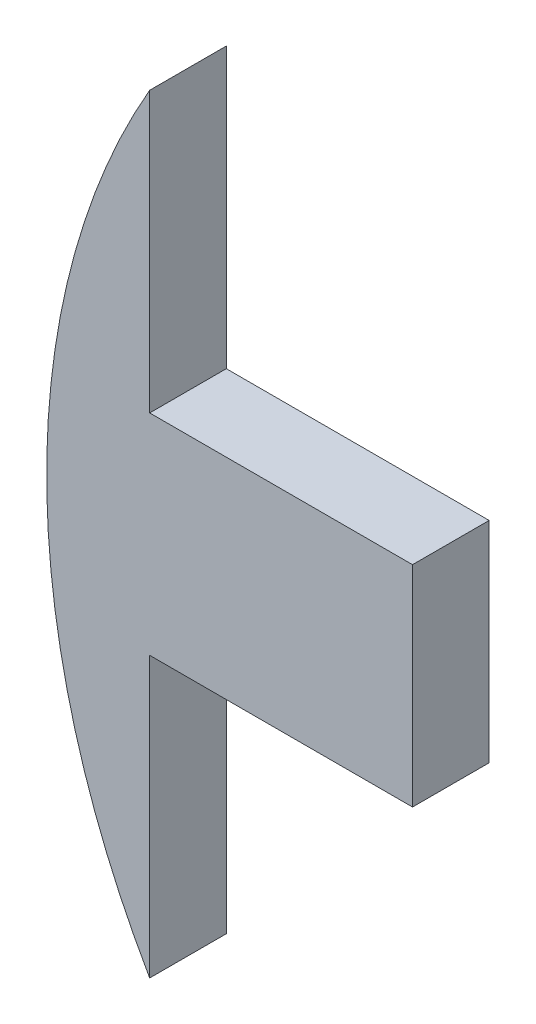
ISO-10303-21;
HEADER;
FILE_DESCRIPTION(('STEP AP214'),'2;1');
FILE_NAME('part.step','',(''),(''),'','','');
FILE_SCHEMA(('AUTOMOTIVE_DESIGN { 1 0 10303 214 1 1 1 1 }'));
ENDSEC;
DATA;
#1=APPLICATION_CONTEXT('core data for automotive mechanical design processes');
#2=APPLICATION_PROTOCOL_DEFINITION('international standard','automotive_design',2000,#1);
#3=PRODUCT_CONTEXT('',#1,'mechanical');
#4=PRODUCT('Part','Part','',(#3));
#5=PRODUCT_RELATED_PRODUCT_CATEGORY('part','',(#4));
#6=PRODUCT_DEFINITION_FORMATION('','',#4);
#7=PRODUCT_DEFINITION_CONTEXT('part definition',#1,'design');
#8=PRODUCT_DEFINITION('design','',#6,#7);
#9=PRODUCT_DEFINITION_SHAPE('','',#8);
#10=(LENGTH_UNIT() NAMED_UNIT(*) SI_UNIT(.MILLI.,.METRE.));
#11=(NAMED_UNIT(*) PLANE_ANGLE_UNIT() SI_UNIT($,.RADIAN.));
#12=(NAMED_UNIT(*) SI_UNIT($,.STERADIAN.) SOLID_ANGLE_UNIT());
#13=UNCERTAINTY_MEASURE_WITH_UNIT(LENGTH_MEASURE(1.E-05),#10,'distance_accuracy_value','');
#14=(GEOMETRIC_REPRESENTATION_CONTEXT(3) GLOBAL_UNCERTAINTY_ASSIGNED_CONTEXT((#13)) GLOBAL_UNIT_ASSIGNED_CONTEXT((#10,
#11,#12)) REPRESENTATION_CONTEXT('',''));
#15=CARTESIAN_POINT('',(0.,0.,0.));
#16=DIRECTION('',(0.,0.,1.));
#17=DIRECTION('',(1.,0.,0.));
#18=AXIS2_PLACEMENT_3D('',#15,#16,#17);
#19=CARTESIAN_POINT('',(-10.5470541140899,0.,3.03));
#20=DIRECTION('',(1.,0.,0.));
#21=DIRECTION('',(0.,0.,-1.));
#22=AXIS2_PLACEMENT_3D('',#19,#20,#21);
#23=PLANE('',#22);
#24=DIRECTION('',(0.,-1.,0.));
#25=VECTOR('',#24,1.);
#26=CARTESIAN_POINT('',(-10.5470541140899,0.,0.));
#27=LINE('',#26,#25);
#28=CARTESIAN_POINT('',(-10.5470541140899,19.1691062135935,0.));
#29=VERTEX_POINT('',#28);
#30=CARTESIAN_POINT('',(-10.5470541140899,8.11910621359348,0.));
#31=VERTEX_POINT('',#30);
#32=EDGE_CURVE('E121',#29,#31,#27,.T.);
#33=ORIENTED_EDGE('',*,*,#32,.F.);
#34=DIRECTION('',(0.,0.,-1.));
#35=VECTOR('',#34,1.);
#36=CARTESIAN_POINT('',(-10.5470541140899,19.1691062135935,3.03));
#37=LINE('',#36,#35);
#38=CARTESIAN_POINT('',(-10.5470541140899,19.1691062135935,3.03));
#39=VERTEX_POINT('',#38);
#40=EDGE_CURVE('E11',#39,#29,#37,.T.);
#41=ORIENTED_EDGE('',*,*,#40,.F.);
#42=DIRECTION('',(0.,-1.,0.));
#43=VECTOR('',#42,1.);
#44=CARTESIAN_POINT('',(-10.5470541140899,0.,3.03));
#45=LINE('',#44,#43);
#46=CARTESIAN_POINT('',(-10.5470541140899,8.11910621359348,3.03));
#47=VERTEX_POINT('',#46);
#48=EDGE_CURVE('E133',#39,#47,#45,.T.);
#49=ORIENTED_EDGE('',*,*,#48,.T.);
#50=DIRECTION('',(0.,0.,-1.));
#51=VECTOR('',#50,1.);
#52=CARTESIAN_POINT('',(-10.5470541140899,8.11910621359348,3.03));
#53=LINE('',#52,#51);
#54=EDGE_CURVE('E55',#47,#31,#53,.T.);
#55=ORIENTED_EDGE('',*,*,#54,.T.);
#56=EDGE_LOOP('',(#33,#41,#49,#55));
#57=FACE_BOUND('',#56,.T.);
#58=ADVANCED_FACE('F39',(#57),#23,.T.);
#59=CARTESIAN_POINT('',(15.7801181609571,3.96910621359348,3.03));
#60=DIRECTION('',(0.,0.,-1.));
#61=DIRECTION('',(-1.,0.,0.));
#62=AXIS2_PLACEMENT_3D('',#59,#60,#61);
#63=CYLINDRICAL_SURFACE('',#62,30.4);
#64=CARTESIAN_POINT('',(15.7801181609571,3.96910621359348,0.));
#65=DIRECTION('',(0.,0.,1.));
#66=DIRECTION('',(1.,0.,0.));
#67=AXIS2_PLACEMENT_3D('',#64,#65,#66);
#68=CIRCLE('',#67,30.4);
#69=CARTESIAN_POINT('',(-10.5470541140899,-11.2308937864065,0.));
#70=VERTEX_POINT('',#69);
#71=EDGE_CURVE('E123',#29,#70,#68,.T.);
#72=ORIENTED_EDGE('',*,*,#71,.T.);
#73=DIRECTION('',(0.,0.,-1.));
#74=VECTOR('',#73,1.);
#75=CARTESIAN_POINT('',(-10.5470541140899,-11.2308937864065,3.03));
#76=LINE('',#75,#74);
#77=CARTESIAN_POINT('',(-10.5470541140899,-11.2308937864065,3.03));
#78=VERTEX_POINT('',#77);
#79=EDGE_CURVE('E47',#78,#70,#76,.T.);
#80=ORIENTED_EDGE('',*,*,#79,.F.);
#81=CARTESIAN_POINT('',(15.7801181609571,3.96910621359348,3.03));
#82=DIRECTION('',(0.,0.,1.));
#83=DIRECTION('',(1.,0.,0.));
#84=AXIS2_PLACEMENT_3D('',#81,#82,#83);
#85=CIRCLE('',#84,30.4);
#86=EDGE_CURVE('E209',#39,#78,#85,.T.);
#87=ORIENTED_EDGE('',*,*,#86,.F.);
#88=ORIENTED_EDGE('',*,*,#40,.T.);
#89=EDGE_LOOP('',(#72,#80,#87,#88));
#90=FACE_BOUND('',#89,.T.);
#91=ADVANCED_FACE('F156',(#90),#63,.T.);
#92=CARTESIAN_POINT('',(-10.5470541140899,0.,3.03));
#93=DIRECTION('',(-1.,0.,0.));
#94=DIRECTION('',(0.,0.,1.));
#95=AXIS2_PLACEMENT_3D('',#92,#93,#94);
#96=PLANE('',#95);
#97=DIRECTION('',(0.,1.,0.));
#98=VECTOR('',#97,1.);
#99=CARTESIAN_POINT('',(-10.5470541140899,0.,0.));
#100=LINE('',#99,#98);
#101=CARTESIAN_POINT('',(-10.5470541140899,-0.180893786406525,0.));
#102=VERTEX_POINT('',#101);
#103=EDGE_CURVE('E125',#70,#102,#100,.T.);
#104=ORIENTED_EDGE('',*,*,#103,.T.);
#105=DIRECTION('',(0.,0.,-1.));
#106=VECTOR('',#105,1.);
#107=CARTESIAN_POINT('',(-10.5470541140899,-0.180893786406525,3.03));
#108=LINE('',#107,#106);
#109=CARTESIAN_POINT('',(-10.5470541140899,-0.180893786406525,3.03));
#110=VERTEX_POINT('',#109);
#111=EDGE_CURVE('E113',#110,#102,#108,.T.);
#112=ORIENTED_EDGE('',*,*,#111,.F.);
#113=DIRECTION('',(0.,1.,0.));
#114=VECTOR('',#113,1.);
#115=CARTESIAN_POINT('',(-10.5470541140899,0.,3.03));
#116=LINE('',#115,#114);
#117=EDGE_CURVE('E101',#78,#110,#116,.T.);
#118=ORIENTED_EDGE('',*,*,#117,.F.);
#119=ORIENTED_EDGE('',*,*,#79,.T.);
#120=EDGE_LOOP('',(#104,#112,#118,#119));
#121=FACE_BOUND('',#120,.T.);
#122=ADVANCED_FACE('F140',(#121),#96,.F.);
#123=CARTESIAN_POINT('',(0.,-0.180893786406525,3.03));
#124=DIRECTION('',(0.,1.,0.));
#125=DIRECTION('',(0.,0.,1.));
#126=AXIS2_PLACEMENT_3D('',#123,#124,#125);
#127=PLANE('',#126);
#128=DIRECTION('',(1.,0.,0.));
#129=VECTOR('',#128,1.);
#130=CARTESIAN_POINT('',(0.,-0.180893786406525,0.));
#131=LINE('',#130,#129);
#132=CARTESIAN_POINT('',(-0.154749268676615,-0.180893786406525,0.));
#133=VERTEX_POINT('',#132);
#134=EDGE_CURVE('E110',#102,#133,#131,.T.);
#135=ORIENTED_EDGE('',*,*,#134,.T.);
#136=DIRECTION('',(0.,0.,-1.));
#137=VECTOR('',#136,1.);
#138=CARTESIAN_POINT('',(-0.154749268676615,-0.180893786406525,3.03));
#139=LINE('',#138,#137);
#140=CARTESIAN_POINT('',(-0.154749268676615,-0.180893786406525,3.03));
#141=VERTEX_POINT('',#140);
#142=EDGE_CURVE('E107',#141,#133,#139,.T.);
#143=ORIENTED_EDGE('',*,*,#142,.F.);
#144=DIRECTION('',(1.,0.,0.));
#145=VECTOR('',#144,1.);
#146=CARTESIAN_POINT('',(0.,-0.180893786406525,3.03));
#147=LINE('',#146,#145);
#148=EDGE_CURVE('E93',#110,#141,#147,.T.);
#149=ORIENTED_EDGE('',*,*,#148,.F.);
#150=ORIENTED_EDGE('',*,*,#111,.T.);
#151=EDGE_LOOP('',(#135,#143,#149,#150));
#152=FACE_BOUND('',#151,.T.);
#153=ADVANCED_FACE('F108',(#152),#127,.F.);
#154=CARTESIAN_POINT('',(-0.154749268676615,0.,3.03));
#155=DIRECTION('',(-1.,0.,0.));
#156=DIRECTION('',(0.,0.,1.));
#157=AXIS2_PLACEMENT_3D('',#154,#155,#156);
#158=PLANE('',#157);
#159=DIRECTION('',(0.,1.,0.));
#160=VECTOR('',#159,1.);
#161=CARTESIAN_POINT('',(-0.154749268676615,0.,0.));
#162=LINE('',#161,#160);
#163=CARTESIAN_POINT('',(-0.154749268676615,8.11910621359348,0.));
#164=VERTEX_POINT('',#163);
#165=EDGE_CURVE('E128',#133,#164,#162,.T.);
#166=ORIENTED_EDGE('',*,*,#165,.T.);
#167=DIRECTION('',(0.,0.,-1.));
#168=VECTOR('',#167,1.);
#169=CARTESIAN_POINT('',(-0.154749268676615,8.11910621359348,3.03));
#170=LINE('',#169,#168);
#171=CARTESIAN_POINT('',(-0.154749268676615,8.11910621359348,3.03));
#172=VERTEX_POINT('',#171);
#173=EDGE_CURVE('E75',#172,#164,#170,.T.);
#174=ORIENTED_EDGE('',*,*,#173,.F.);
#175=DIRECTION('',(0.,1.,0.));
#176=VECTOR('',#175,1.);
#177=CARTESIAN_POINT('',(-0.154749268676615,0.,3.03));
#178=LINE('',#177,#176);
#179=EDGE_CURVE('E99',#141,#172,#178,.T.);
#180=ORIENTED_EDGE('',*,*,#179,.F.);
#181=ORIENTED_EDGE('',*,*,#142,.T.);
#182=EDGE_LOOP('',(#166,#174,#180,#181));
#183=FACE_BOUND('',#182,.T.);
#184=ADVANCED_FACE('F115',(#183),#158,.F.);
#185=CARTESIAN_POINT('',(0.,8.11910621359348,3.03));
#186=DIRECTION('',(0.,1.,0.));
#187=DIRECTION('',(0.,0.,1.));
#188=AXIS2_PLACEMENT_3D('',#185,#186,#187);
#189=PLANE('',#188);
#190=DIRECTION('',(1.,0.,0.));
#191=VECTOR('',#190,1.);
#192=CARTESIAN_POINT('',(0.,8.11910621359348,0.));
#193=LINE('',#192,#191);
#194=EDGE_CURVE('E130',#31,#164,#193,.T.);
#195=ORIENTED_EDGE('',*,*,#194,.F.);
#196=ORIENTED_EDGE('',*,*,#54,.F.);
#197=DIRECTION('',(1.,0.,0.));
#198=VECTOR('',#197,1.);
#199=CARTESIAN_POINT('',(0.,8.11910621359348,3.03));
#200=LINE('',#199,#198);
#201=EDGE_CURVE('E116',#47,#172,#200,.T.);
#202=ORIENTED_EDGE('',*,*,#201,.T.);
#203=ORIENTED_EDGE('',*,*,#173,.T.);
#204=EDGE_LOOP('',(#195,#196,#202,#203));
#205=FACE_BOUND('',#204,.T.);
#206=ADVANCED_FACE('F145',(#205),#189,.T.);
#207=CARTESIAN_POINT('',(0.,0.,3.03));
#208=DIRECTION('',(0.,0.,1.));
#209=DIRECTION('',(1.,0.,0.));
#210=AXIS2_PLACEMENT_3D('',#207,#208,#209);
#211=PLANE('',#210);
#212=ORIENTED_EDGE('',*,*,#48,.F.);
#213=ORIENTED_EDGE('',*,*,#86,.T.);
#214=ORIENTED_EDGE('',*,*,#117,.T.);
#215=ORIENTED_EDGE('',*,*,#148,.T.);
#216=ORIENTED_EDGE('',*,*,#179,.T.);
#217=ORIENTED_EDGE('',*,*,#201,.F.);
#218=EDGE_LOOP('',(#212,#213,#214,#215,#216,#217));
#219=FACE_BOUND('',#218,.T.);
#220=ADVANCED_FACE('F96',(#219),#211,.T.);
#221=CARTESIAN_POINT('',(0.,0.,0.));
#222=DIRECTION('',(0.,0.,1.));
#223=DIRECTION('',(1.,0.,0.));
#224=AXIS2_PLACEMENT_3D('',#221,#222,#223);
#225=PLANE('',#224);
#226=ORIENTED_EDGE('',*,*,#32,.T.);
#227=ORIENTED_EDGE('',*,*,#194,.T.);
#228=ORIENTED_EDGE('',*,*,#165,.F.);
#229=ORIENTED_EDGE('',*,*,#134,.F.);
#230=ORIENTED_EDGE('',*,*,#103,.F.);
#231=ORIENTED_EDGE('',*,*,#71,.F.);
#232=EDGE_LOOP('',(#226,#227,#228,#229,#230,#231));
#233=FACE_BOUND('',#232,.T.);
#234=ADVANCED_FACE('F144',(#233),#225,.F.);
#235=CLOSED_SHELL('',(#58,#91,#122,#153,#184,#206,#220,#234));
#236=MANIFOLD_SOLID_BREP('B2',#235);
#237=ADVANCED_BREP_SHAPE_REPRESENTATION('',(#18,#236),#14);
#238=SHAPE_DEFINITION_REPRESENTATION(#9,#237);
ENDSEC;
END-ISO-10303-21;
